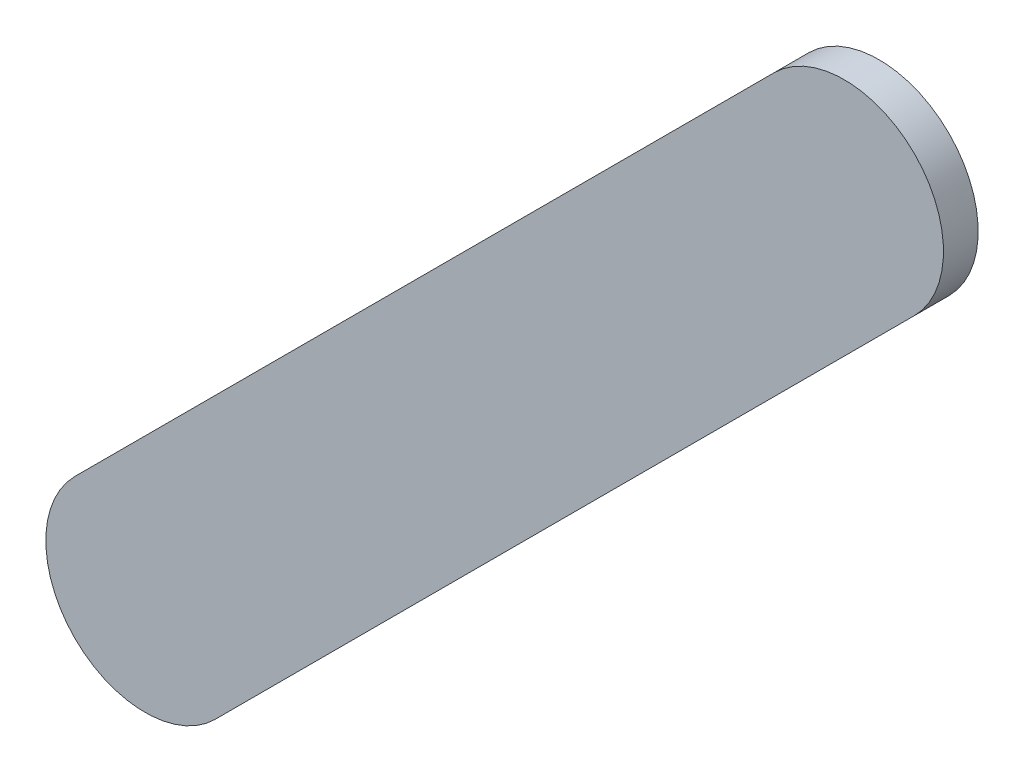
ISO-10303-21;
HEADER;
FILE_DESCRIPTION(('STEP AP214'),'2;1');
FILE_NAME('part.step','',(''),(''),'','','');
FILE_SCHEMA(('AUTOMOTIVE_DESIGN { 1 0 10303 214 1 1 1 1 }'));
ENDSEC;
DATA;
#1=APPLICATION_CONTEXT('core data for automotive mechanical design processes');
#2=APPLICATION_PROTOCOL_DEFINITION('international standard','automotive_design',2000,#1);
#3=PRODUCT_CONTEXT('',#1,'mechanical');
#4=PRODUCT('Part','Part','',(#3));
#5=PRODUCT_RELATED_PRODUCT_CATEGORY('part','',(#4));
#6=PRODUCT_DEFINITION_FORMATION('','',#4);
#7=PRODUCT_DEFINITION_CONTEXT('part definition',#1,'design');
#8=PRODUCT_DEFINITION('design','',#6,#7);
#9=PRODUCT_DEFINITION_SHAPE('','',#8);
#10=(LENGTH_UNIT() NAMED_UNIT(*) SI_UNIT(.MILLI.,.METRE.));
#11=(NAMED_UNIT(*) PLANE_ANGLE_UNIT() SI_UNIT($,.RADIAN.));
#12=(NAMED_UNIT(*) SI_UNIT($,.STERADIAN.) SOLID_ANGLE_UNIT());
#13=UNCERTAINTY_MEASURE_WITH_UNIT(LENGTH_MEASURE(1.E-05),#10,'distance_accuracy_value','');
#14=(GEOMETRIC_REPRESENTATION_CONTEXT(3) GLOBAL_UNCERTAINTY_ASSIGNED_CONTEXT((#13)) GLOBAL_UNIT_ASSIGNED_CONTEXT((#10,
#11,#12)) REPRESENTATION_CONTEXT('',''));
#15=CARTESIAN_POINT('',(0.,0.,0.));
#16=DIRECTION('',(0.,0.,1.));
#17=DIRECTION('',(1.,0.,0.));
#18=AXIS2_PLACEMENT_3D('',#15,#16,#17);
#19=CARTESIAN_POINT('',(97.284315,-105.779289,1.635));
#20=DIRECTION('',(0.,0.,1.));
#21=DIRECTION('',(1.,0.,0.));
#22=AXIS2_PLACEMENT_3D('',#19,#20,#21);
#23=PLANE('',#22);
#24=DIRECTION('',(-0.707106781186548,-0.707106781186548,0.));
#25=VECTOR('',#24,1.);
#26=CARTESIAN_POINT('',(97.284315,-105.779289,1.635));
#27=LINE('',#26,#25);
#28=CARTESIAN_POINT('',(97.284315,-105.779289,1.635));
#29=VERTEX_POINT('',#28);
#30=CARTESIAN_POINT('',(96.579289,-106.484315,1.635));
#31=VERTEX_POINT('',#30);
#32=EDGE_CURVE('E82',#29,#31,#27,.T.);
#33=ORIENTED_EDGE('',*,*,#32,.T.);
#34=CARTESIAN_POINT('',(96.6499995,-106.5550255,1.635));
#35=DIRECTION('',(0.,0.,1.));
#36=DIRECTION('',(-0.707106781186548,0.707106781186548,0.));
#37=AXIS2_PLACEMENT_3D('',#34,#35,#36);
#38=CIRCLE('',#37,0.09999974810219);
#39=CARTESIAN_POINT('',(96.72071,-106.625736,1.635));
#40=VERTEX_POINT('',#39);
#41=EDGE_CURVE('E98',#31,#40,#38,.T.);
#42=ORIENTED_EDGE('',*,*,#41,.T.);
#43=DIRECTION('',(0.707106781186548,0.707106781186548,0.));
#44=VECTOR('',#43,1.);
#45=CARTESIAN_POINT('',(96.72071,-106.625736,1.635));
#46=LINE('',#45,#44);
#47=CARTESIAN_POINT('',(97.425736,-105.92071,1.635));
#48=VERTEX_POINT('',#47);
#49=EDGE_CURVE('E75',#40,#48,#46,.T.);
#50=ORIENTED_EDGE('',*,*,#49,.T.);
#51=CARTESIAN_POINT('',(97.3550255,-105.8499995,1.635));
#52=DIRECTION('',(0.,0.,1.));
#53=DIRECTION('',(0.707106781186048,-0.707106781187048,0.));
#54=AXIS2_PLACEMENT_3D('',#51,#52,#53);
#55=CIRCLE('',#54,0.09999974810218);
#56=EDGE_CURVE('E11',#48,#29,#55,.T.);
#57=ORIENTED_EDGE('',*,*,#56,.T.);
#58=EDGE_LOOP('',(#33,#42,#50,#57));
#59=FACE_BOUND('',#58,.T.);
#60=ADVANCED_FACE('F17',(#59),#23,.T.);
#61=CARTESIAN_POINT('',(97.284315,-105.779289,1.6));
#62=DIRECTION('',(0.,0.,1.));
#63=DIRECTION('',(1.,0.,0.));
#64=AXIS2_PLACEMENT_3D('',#61,#62,#63);
#65=PLANE('',#64);
#66=CARTESIAN_POINT('',(97.3550255,-105.8499995,1.6));
#67=DIRECTION('',(0.,0.,1.));
#68=DIRECTION('',(0.707106781186048,-0.707106781187048,0.));
#69=AXIS2_PLACEMENT_3D('',#66,#67,#68);
#70=CIRCLE('',#69,0.09999974810218);
#71=CARTESIAN_POINT('',(97.425736,-105.92071,1.6));
#72=VERTEX_POINT('',#71);
#73=CARTESIAN_POINT('',(97.284315,-105.779289,1.6));
#74=VERTEX_POINT('',#73);
#75=EDGE_CURVE('E20',#72,#74,#70,.T.);
#76=ORIENTED_EDGE('',*,*,#75,.F.);
#77=DIRECTION('',(0.707106781186548,0.707106781186548,0.));
#78=VECTOR('',#77,1.);
#79=CARTESIAN_POINT('',(96.72071,-106.625736,1.6));
#80=LINE('',#79,#78);
#81=CARTESIAN_POINT('',(96.72071,-106.625736,1.6));
#82=VERTEX_POINT('',#81);
#83=EDGE_CURVE('E101',#82,#72,#80,.T.);
#84=ORIENTED_EDGE('',*,*,#83,.F.);
#85=CARTESIAN_POINT('',(96.6499995,-106.5550255,1.6));
#86=DIRECTION('',(0.,0.,1.));
#87=DIRECTION('',(-0.707106781186548,0.707106781186548,0.));
#88=AXIS2_PLACEMENT_3D('',#85,#86,#87);
#89=CIRCLE('',#88,0.09999974810219);
#90=CARTESIAN_POINT('',(96.579289,-106.484315,1.6));
#91=VERTEX_POINT('',#90);
#92=EDGE_CURVE('E84',#91,#82,#89,.T.);
#93=ORIENTED_EDGE('',*,*,#92,.F.);
#94=DIRECTION('',(-0.707106781186548,-0.707106781186548,0.));
#95=VECTOR('',#94,1.);
#96=CARTESIAN_POINT('',(97.284315,-105.779289,1.6));
#97=LINE('',#96,#95);
#98=EDGE_CURVE('E80',#74,#91,#97,.T.);
#99=ORIENTED_EDGE('',*,*,#98,.F.);
#100=EDGE_LOOP('',(#76,#84,#93,#99));
#101=FACE_BOUND('',#100,.T.);
#102=ADVANCED_FACE('F86',(#101),#65,.F.);
#103=CARTESIAN_POINT('',(97.3550255,-105.8499995,1.6));
#104=DIRECTION('',(0.,0.,-1.));
#105=DIRECTION('',(0.707106781186048,-0.707106781187048,0.));
#106=AXIS2_PLACEMENT_3D('',#103,#104,#105);
#107=CYLINDRICAL_SURFACE('',#106,0.09999974810218);
#108=ORIENTED_EDGE('',*,*,#75,.T.);
#109=DIRECTION('',(0.,0.,1.));
#110=VECTOR('',#109,1.);
#111=CARTESIAN_POINT('',(97.284315,-105.779289,1.6));
#112=LINE('',#111,#110);
#113=EDGE_CURVE('E69',#74,#29,#112,.T.);
#114=ORIENTED_EDGE('',*,*,#113,.T.);
#115=ORIENTED_EDGE('',*,*,#56,.F.);
#116=DIRECTION('',(0.,0.,1.));
#117=VECTOR('',#116,1.);
#118=CARTESIAN_POINT('',(97.425736,-105.92071,1.6));
#119=LINE('',#118,#117);
#120=EDGE_CURVE('E72',#72,#48,#119,.T.);
#121=ORIENTED_EDGE('',*,*,#120,.F.);
#122=EDGE_LOOP('',(#108,#114,#115,#121));
#123=FACE_BOUND('',#122,.T.);
#124=ADVANCED_FACE('F68',(#123),#107,.T.);
#125=CARTESIAN_POINT('',(96.72071,-106.625736,1.6));
#126=DIRECTION('',(-0.707106781186548,0.707106781186548,0.));
#127=DIRECTION('',(0.,0.,1.));
#128=AXIS2_PLACEMENT_3D('',#125,#126,#127);
#129=PLANE('',#128);
#130=ORIENTED_EDGE('',*,*,#83,.T.);
#131=ORIENTED_EDGE('',*,*,#120,.T.);
#132=ORIENTED_EDGE('',*,*,#49,.F.);
#133=DIRECTION('',(0.,0.,1.));
#134=VECTOR('',#133,1.);
#135=CARTESIAN_POINT('',(96.72071,-106.625736,1.6));
#136=LINE('',#135,#134);
#137=EDGE_CURVE('E102',#82,#40,#136,.T.);
#138=ORIENTED_EDGE('',*,*,#137,.F.);
#139=EDGE_LOOP('',(#130,#131,#132,#138));
#140=FACE_BOUND('',#139,.T.);
#141=ADVANCED_FACE('F120',(#140),#129,.F.);
#142=CARTESIAN_POINT('',(96.6499995,-106.5550255,1.6));
#143=DIRECTION('',(0.,0.,-1.));
#144=DIRECTION('',(-0.707106781186548,0.707106781186548,0.));
#145=AXIS2_PLACEMENT_3D('',#142,#143,#144);
#146=CYLINDRICAL_SURFACE('',#145,0.09999974810219);
#147=ORIENTED_EDGE('',*,*,#92,.T.);
#148=ORIENTED_EDGE('',*,*,#137,.T.);
#149=ORIENTED_EDGE('',*,*,#41,.F.);
#150=DIRECTION('',(0.,0.,1.));
#151=VECTOR('',#150,1.);
#152=CARTESIAN_POINT('',(96.579289,-106.484315,1.6));
#153=LINE('',#152,#151);
#154=EDGE_CURVE('E90',#91,#31,#153,.T.);
#155=ORIENTED_EDGE('',*,*,#154,.F.);
#156=EDGE_LOOP('',(#147,#148,#149,#155));
#157=FACE_BOUND('',#156,.T.);
#158=ADVANCED_FACE('F122',(#157),#146,.T.);
#159=CARTESIAN_POINT('',(97.284315,-105.779289,1.6));
#160=DIRECTION('',(0.707106781186548,-0.707106781186548,0.));
#161=DIRECTION('',(0.,0.,-1.));
#162=AXIS2_PLACEMENT_3D('',#159,#160,#161);
#163=PLANE('',#162);
#164=ORIENTED_EDGE('',*,*,#98,.T.);
#165=ORIENTED_EDGE('',*,*,#154,.T.);
#166=ORIENTED_EDGE('',*,*,#32,.F.);
#167=ORIENTED_EDGE('',*,*,#113,.F.);
#168=EDGE_LOOP('',(#164,#165,#166,#167));
#169=FACE_BOUND('',#168,.T.);
#170=ADVANCED_FACE('F78',(#169),#163,.F.);
#171=CLOSED_SHELL('',(#60,#102,#124,#141,#158,#170));
#172=MANIFOLD_SOLID_BREP('B1',#171);
#173=ADVANCED_BREP_SHAPE_REPRESENTATION('',(#18,#172),#14);
#174=SHAPE_DEFINITION_REPRESENTATION(#9,#173);
ENDSEC;
END-ISO-10303-21;
